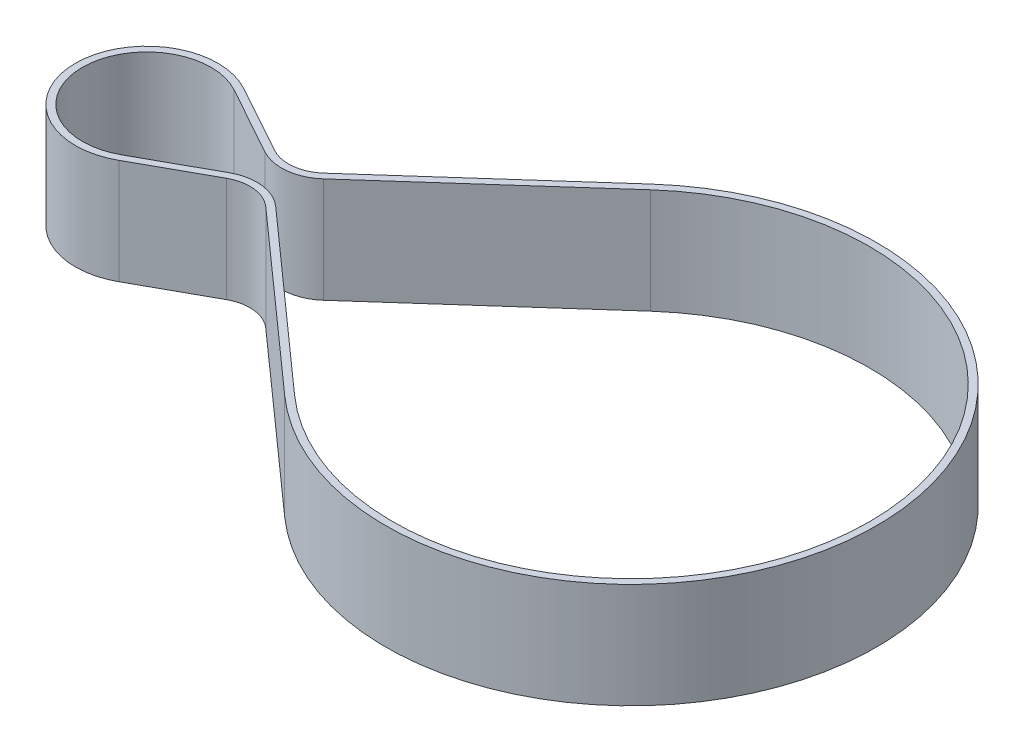
ISO-10303-21;
HEADER;
FILE_DESCRIPTION(('STEP AP214'),'2;1');
FILE_NAME('part.step','',(''),(''),'','','');
FILE_SCHEMA(('AUTOMOTIVE_DESIGN { 1 0 10303 214 1 1 1 1 }'));
ENDSEC;
DATA;
#1=APPLICATION_CONTEXT('core data for automotive mechanical design processes');
#2=APPLICATION_PROTOCOL_DEFINITION('international standard','automotive_design',2000,#1);
#3=PRODUCT_CONTEXT('',#1,'mechanical');
#4=PRODUCT('Part','Part','',(#3));
#5=PRODUCT_RELATED_PRODUCT_CATEGORY('part','',(#4));
#6=PRODUCT_DEFINITION_FORMATION('','',#4);
#7=PRODUCT_DEFINITION_CONTEXT('part definition',#1,'design');
#8=PRODUCT_DEFINITION('design','',#6,#7);
#9=PRODUCT_DEFINITION_SHAPE('','',#8);
#10=(LENGTH_UNIT() NAMED_UNIT(*) SI_UNIT(.MILLI.,.METRE.));
#11=(NAMED_UNIT(*) PLANE_ANGLE_UNIT() SI_UNIT($,.RADIAN.));
#12=(NAMED_UNIT(*) SI_UNIT($,.STERADIAN.) SOLID_ANGLE_UNIT());
#13=UNCERTAINTY_MEASURE_WITH_UNIT(LENGTH_MEASURE(1.E-05),#10,'distance_accuracy_value','');
#14=(GEOMETRIC_REPRESENTATION_CONTEXT(3) GLOBAL_UNCERTAINTY_ASSIGNED_CONTEXT((#13)) GLOBAL_UNIT_ASSIGNED_CONTEXT((#10,
#11,#12)) REPRESENTATION_CONTEXT('',''));
#15=CARTESIAN_POINT('',(0.,0.,0.));
#16=DIRECTION('',(0.,0.,1.));
#17=DIRECTION('',(1.,0.,0.));
#18=AXIS2_PLACEMENT_3D('',#15,#16,#17);
#19=CARTESIAN_POINT('',(-50.4883588292062,15.,-3.02002185360535));
#20=DIRECTION('',(0.,-1.,0.));
#21=DIRECTION('',(0.,0.,-1.));
#22=AXIS2_PLACEMENT_3D('',#19,#20,#21);
#23=CYLINDRICAL_SURFACE('',#22,9.17);
#24=CARTESIAN_POINT('',(-50.4883588292062,0.,-3.02002185360535));
#25=DIRECTION('',(0.,1.,0.));
#26=DIRECTION('',(0.,0.,1.));
#27=AXIS2_PLACEMENT_3D('',#24,#25,#26);
#28=CIRCLE('',#27,9.17);
#29=CARTESIAN_POINT('',(-46.0534820792553,0.,-11.0462767843152));
#30=VERTEX_POINT('',#29);
#31=CARTESIAN_POINT('',(-46.0534820792553,0.,5.0062330771045));
#32=VERTEX_POINT('',#31);
#33=EDGE_CURVE('E229',#30,#32,#28,.T.);
#34=ORIENTED_EDGE('',*,*,#33,.F.);
#35=DIRECTION('',(0.,-1.,0.));
#36=VECTOR('',#35,1.);
#37=CARTESIAN_POINT('',(-46.0534820792553,15.,-11.0462767843152));
#38=LINE('',#37,#36);
#39=CARTESIAN_POINT('',(-46.0534820792553,15.,-11.0462767843152));
#40=VERTEX_POINT('',#39);
#41=EDGE_CURVE('E11',#40,#30,#38,.T.);
#42=ORIENTED_EDGE('',*,*,#41,.F.);
#43=CARTESIAN_POINT('',(-50.4883588292062,15.,-3.02002185360535));
#44=DIRECTION('',(0.,1.,0.));
#45=DIRECTION('',(0.,0.,1.));
#46=AXIS2_PLACEMENT_3D('',#43,#44,#45);
#47=CIRCLE('',#46,9.17);
#48=CARTESIAN_POINT('',(-46.0534820792553,15.,5.0062330771045));
#49=VERTEX_POINT('',#48);
#50=EDGE_CURVE('E547',#40,#49,#47,.T.);
#51=ORIENTED_EDGE('',*,*,#50,.T.);
#52=DIRECTION('',(0.,-1.,0.));
#53=VECTOR('',#52,1.);
#54=CARTESIAN_POINT('',(-46.0534820792553,15.,5.0062330771045));
#55=LINE('',#54,#53);
#56=EDGE_CURVE('E63',#49,#32,#55,.T.);
#57=ORIENTED_EDGE('',*,*,#56,.T.);
#58=EDGE_LOOP('',(#34,#42,#51,#57));
#59=FACE_BOUND('',#58,.T.);
#60=ADVANCED_FACE('F43',(#59),#23,.F.);
#61=CARTESIAN_POINT('',(-6.09579559936457,15.,11.0321914778218));
#62=DIRECTION('',(0.483628871314175,0.,-0.875273165835316));
#63=DIRECTION('',(-0.875273165835316,0.,-0.483628871314175));
#64=AXIS2_PLACEMENT_3D('',#61,#62,#63);
#65=PLANE('',#64);
#66=DIRECTION('',(0.875273165835316,0.,0.483628871314175));
#67=VECTOR('',#66,1.);
#68=CARTESIAN_POINT('',(-6.09579559936457,0.,11.0321914778218));
#69=LINE('',#68,#67);
#70=CARTESIAN_POINT('',(-36.1619464927484,0.,-5.5807462756758));
#71=VERTEX_POINT('',#70);
#72=EDGE_CURVE('E232',#30,#71,#69,.T.);
#73=ORIENTED_EDGE('',*,*,#72,.T.);
#74=DIRECTION('',(0.,-1.,0.));
#75=VECTOR('',#74,1.);
#76=CARTESIAN_POINT('',(-36.1619464927484,15.,-5.5807462756758));
#77=LINE('',#76,#75);
#78=CARTESIAN_POINT('',(-36.1619464927484,15.,-5.5807462756758));
#79=VERTEX_POINT('',#78);
#80=EDGE_CURVE('E54',#79,#71,#77,.T.);
#81=ORIENTED_EDGE('',*,*,#80,.F.);
#82=DIRECTION('',(0.875273165835316,0.,0.483628871314175));
#83=VECTOR('',#82,1.);
#84=CARTESIAN_POINT('',(-6.09579559936457,15.,11.0321914778218));
#85=LINE('',#84,#83);
#86=EDGE_CURVE('E543',#40,#79,#85,.T.);
#87=ORIENTED_EDGE('',*,*,#86,.F.);
#88=ORIENTED_EDGE('',*,*,#41,.T.);
#89=EDGE_LOOP('',(#73,#81,#87,#88));
#90=FACE_BOUND('',#89,.T.);
#91=ADVANCED_FACE('F347',(#90),#65,.F.);
#92=CARTESIAN_POINT('',(-33.0183588292062,15.,-11.2700218536054));
#93=DIRECTION('',(0.,-1.,0.));
#94=DIRECTION('',(0.,0.,-1.));
#95=AXIS2_PLACEMENT_3D('',#92,#93,#94);
#96=CYLINDRICAL_SURFACE('',#95,6.5);
#97=CARTESIAN_POINT('',(-33.0183588292062,0.,-11.2700218536054));
#98=DIRECTION('',(0.,1.,0.));
#99=DIRECTION('',(0.,0.,1.));
#100=AXIS2_PLACEMENT_3D('',#97,#98,#99);
#101=CIRCLE('',#100,6.5);
#102=CARTESIAN_POINT('',(-28.695184756989,0.,-6.41614032009958));
#103=VERTEX_POINT('',#102);
#104=EDGE_CURVE('E236',#71,#103,#101,.T.);
#105=ORIENTED_EDGE('',*,*,#104,.T.);
#106=DIRECTION('',(0.,-1.,0.));
#107=VECTOR('',#106,1.);
#108=CARTESIAN_POINT('',(-28.695184756989,15.,-6.41614032009958));
#109=LINE('',#108,#107);
#110=CARTESIAN_POINT('',(-28.695184756989,15.,-6.41614032009958));
#111=VERTEX_POINT('',#110);
#112=EDGE_CURVE('E267',#111,#103,#109,.T.);
#113=ORIENTED_EDGE('',*,*,#112,.F.);
#114=CARTESIAN_POINT('',(-33.0183588292062,15.,-11.2700218536054));
#115=DIRECTION('',(0.,1.,0.));
#116=DIRECTION('',(0.,0.,1.));
#117=AXIS2_PLACEMENT_3D('',#114,#115,#116);
#118=CIRCLE('',#117,6.5);
#119=EDGE_CURVE('E540',#79,#111,#118,.T.);
#120=ORIENTED_EDGE('',*,*,#119,.F.);
#121=ORIENTED_EDGE('',*,*,#80,.T.);
#122=EDGE_LOOP('',(#105,#113,#120,#121));
#123=FACE_BOUND('',#122,.T.);
#124=ADVANCED_FACE('F352',(#123),#96,.T.);
#125=CARTESIAN_POINT('',(-15.8803704468532,15.,-17.8298249317724));
#126=DIRECTION('',(-0.665103703418041,0.,-0.746751005154735));
#127=DIRECTION('',(-0.746751005154735,0.,0.665103703418041));
#128=AXIS2_PLACEMENT_3D('',#125,#126,#127);
#129=PLANE('',#128);
#130=DIRECTION('',(0.746751005154735,0.,-0.665103703418041));
#131=VECTOR('',#130,1.);
#132=CARTESIAN_POINT('',(-15.8803704468532,0.,-17.8298249317724));
#133=LINE('',#132,#131);
#134=CARTESIAN_POINT('',(-4.00188474541963,0.,-28.4095560288663));
#135=VERTEX_POINT('',#134);
#136=EDGE_CURVE('E240',#103,#135,#133,.T.);
#137=ORIENTED_EDGE('',*,*,#136,.T.);
#138=DIRECTION('',(0.,-1.,0.));
#139=VECTOR('',#138,1.);
#140=CARTESIAN_POINT('',(-4.00188474541963,15.,-28.4095560288663));
#141=LINE('',#140,#139);
#142=CARTESIAN_POINT('',(-4.00188474541963,15.,-28.4095560288663));
#143=VERTEX_POINT('',#142);
#144=EDGE_CURVE('E264',#143,#135,#141,.T.);
#145=ORIENTED_EDGE('',*,*,#144,.F.);
#146=DIRECTION('',(0.746751005154735,0.,-0.665103703418041));
#147=VECTOR('',#146,1.);
#148=CARTESIAN_POINT('',(-15.8803704468532,15.,-17.8298249317724));
#149=LINE('',#148,#147);
#150=EDGE_CURVE('E192',#111,#143,#149,.T.);
#151=ORIENTED_EDGE('',*,*,#150,.F.);
#152=ORIENTED_EDGE('',*,*,#112,.T.);
#153=EDGE_LOOP('',(#137,#145,#151,#152));
#154=FACE_BOUND('',#153,.T.);
#155=ADVANCED_FACE('F498',(#154),#129,.F.);
#156=CARTESIAN_POINT('',(18.6116411707938,15.,-3.02002185360535));
#157=DIRECTION('',(0.,-1.,0.));
#158=DIRECTION('',(0.,0.,-1.));
#159=AXIS2_PLACEMENT_3D('',#156,#157,#158);
#160=CYLINDRICAL_SURFACE('',#159,34.);
#161=CARTESIAN_POINT('',(18.6116411707938,0.,-3.02002185360535));
#162=DIRECTION('',(0.,1.,0.));
#163=DIRECTION('',(0.,0.,1.));
#164=AXIS2_PLACEMENT_3D('',#161,#162,#163);
#165=CIRCLE('',#164,34.);
#166=CARTESIAN_POINT('',(-4.00188474541964,0.,22.3695123216556));
#167=VERTEX_POINT('',#166);
#168=EDGE_CURVE('E244',#167,#135,#165,.T.);
#169=ORIENTED_EDGE('',*,*,#168,.F.);
#170=DIRECTION('',(0.,-1.,0.));
#171=VECTOR('',#170,1.);
#172=CARTESIAN_POINT('',(-4.00188474541964,15.,22.3695123216556));
#173=LINE('',#172,#171);
#174=CARTESIAN_POINT('',(-4.00188474541964,15.,22.3695123216556));
#175=VERTEX_POINT('',#174);
#176=EDGE_CURVE('E175',#175,#167,#173,.T.);
#177=ORIENTED_EDGE('',*,*,#176,.F.);
#178=CARTESIAN_POINT('',(18.6116411707938,15.,-3.02002185360535));
#179=DIRECTION('',(0.,1.,0.));
#180=DIRECTION('',(0.,0.,1.));
#181=AXIS2_PLACEMENT_3D('',#178,#179,#180);
#182=CIRCLE('',#181,34.);
#183=EDGE_CURVE('E188',#175,#143,#182,.T.);
#184=ORIENTED_EDGE('',*,*,#183,.T.);
#185=ORIENTED_EDGE('',*,*,#144,.T.);
#186=EDGE_LOOP('',(#169,#177,#184,#185));
#187=FACE_BOUND('',#186,.T.);
#188=ADVANCED_FACE('F490',(#187),#160,.F.);
#189=CARTESIAN_POINT('',(-12.8804809102104,15.,14.4616726942662));
#190=DIRECTION('',(0.665103703418041,0.,-0.746751005154735));
#191=DIRECTION('',(-0.746751005154735,0.,-0.665103703418041));
#192=AXIS2_PLACEMENT_3D('',#189,#190,#191);
#193=PLANE('',#192);
#194=DIRECTION('',(0.746751005154735,0.,0.665103703418041));
#195=VECTOR('',#194,1.);
#196=CARTESIAN_POINT('',(-12.8804809102104,0.,14.4616726942662));
#197=LINE('',#196,#195);
#198=CARTESIAN_POINT('',(-28.695184756989,0.,0.376096612888868));
#199=VERTEX_POINT('',#198);
#200=EDGE_CURVE('E171',#199,#167,#197,.T.);
#201=ORIENTED_EDGE('',*,*,#200,.F.);
#202=DIRECTION('',(0.,-1.,0.));
#203=VECTOR('',#202,1.);
#204=CARTESIAN_POINT('',(-28.695184756989,15.,0.376096612888868));
#205=LINE('',#204,#203);
#206=CARTESIAN_POINT('',(-28.695184756989,15.,0.376096612888868));
#207=VERTEX_POINT('',#206);
#208=EDGE_CURVE('E165',#207,#199,#205,.T.);
#209=ORIENTED_EDGE('',*,*,#208,.F.);
#210=DIRECTION('',(0.746751005154735,0.,0.665103703418041));
#211=VECTOR('',#210,1.);
#212=CARTESIAN_POINT('',(-12.8804809102104,15.,14.4616726942662));
#213=LINE('',#212,#211);
#214=EDGE_CURVE('E169',#207,#175,#213,.T.);
#215=ORIENTED_EDGE('',*,*,#214,.T.);
#216=ORIENTED_EDGE('',*,*,#176,.T.);
#217=EDGE_LOOP('',(#201,#209,#215,#216));
#218=FACE_BOUND('',#217,.T.);
#219=ADVANCED_FACE('F167',(#218),#193,.T.);
#220=CARTESIAN_POINT('',(-33.0183588292062,15.,5.22997814639465));
#221=DIRECTION('',(0.,-1.,0.));
#222=DIRECTION('',(0.,0.,-1.));
#223=AXIS2_PLACEMENT_3D('',#220,#221,#222);
#224=CYLINDRICAL_SURFACE('',#223,6.5);
#225=CARTESIAN_POINT('',(-33.0183588292062,0.,5.22997814639465));
#226=DIRECTION('',(0.,1.,0.));
#227=DIRECTION('',(0.,0.,1.));
#228=AXIS2_PLACEMENT_3D('',#225,#226,#227);
#229=CIRCLE('',#228,6.5);
#230=CARTESIAN_POINT('',(-36.1619464927484,0.,-0.459297431534906));
#231=VERTEX_POINT('',#230);
#232=EDGE_CURVE('E250',#199,#231,#229,.T.);
#233=ORIENTED_EDGE('',*,*,#232,.T.);
#234=DIRECTION('',(0.,-1.,0.));
#235=VECTOR('',#234,1.);
#236=CARTESIAN_POINT('',(-36.1619464927484,15.,-0.459297431534906));
#237=LINE('',#236,#235);
#238=CARTESIAN_POINT('',(-36.1619464927484,15.,-0.459297431534906));
#239=VERTEX_POINT('',#238);
#240=EDGE_CURVE('E113',#239,#231,#237,.T.);
#241=ORIENTED_EDGE('',*,*,#240,.F.);
#242=CARTESIAN_POINT('',(-33.0183588292062,15.,5.22997814639465));
#243=DIRECTION('',(0.,1.,0.));
#244=DIRECTION('',(0.,0.,1.));
#245=AXIS2_PLACEMENT_3D('',#242,#243,#244);
#246=CIRCLE('',#245,6.5);
#247=EDGE_CURVE('E177',#207,#239,#246,.T.);
#248=ORIENTED_EDGE('',*,*,#247,.F.);
#249=ORIENTED_EDGE('',*,*,#208,.T.);
#250=EDGE_LOOP('',(#233,#241,#248,#249));
#251=FACE_BOUND('',#250,.T.);
#252=ADVANCED_FACE('F178',(#251),#224,.T.);
#253=CARTESIAN_POINT('',(-5.61216672805039,15.,10.1569183119865));
#254=DIRECTION('',(0.483628871314175,0.,-0.875273165835316));
#255=DIRECTION('',(-0.875273165835316,0.,-0.483628871314175));
#256=AXIS2_PLACEMENT_3D('',#253,#254,#255);
#257=PLANE('',#256);
#258=DIRECTION('',(0.875273165835317,0.,0.483628871314175));
#259=VECTOR('',#258,1.);
#260=CARTESIAN_POINT('',(-5.61216672805039,0.,10.1569183119865));
#261=LINE('',#260,#259);
#262=CARTESIAN_POINT('',(-45.5698532079411,0.,-11.9215499501505));
#263=VERTEX_POINT('',#262);
#264=CARTESIAN_POINT('',(-35.6783176214342,0.,-6.45601944151111));
#265=VERTEX_POINT('',#264);
#266=EDGE_CURVE('E199',#263,#265,#261,.T.);
#267=ORIENTED_EDGE('',*,*,#266,.F.);
#268=DIRECTION('',(0.,-1.,0.));
#269=VECTOR('',#268,1.);
#270=CARTESIAN_POINT('',(-45.5698532079411,15.,-11.9215499501505));
#271=LINE('',#270,#269);
#272=CARTESIAN_POINT('',(-45.5698532079411,15.,-11.9215499501505));
#273=VERTEX_POINT('',#272);
#274=EDGE_CURVE('E47',#273,#263,#271,.T.);
#275=ORIENTED_EDGE('',*,*,#274,.F.);
#276=DIRECTION('',(0.875273165835317,0.,0.483628871314175));
#277=VECTOR('',#276,1.);
#278=CARTESIAN_POINT('',(-5.61216672805039,15.,10.1569183119865));
#279=LINE('',#278,#277);
#280=CARTESIAN_POINT('',(-35.6783176214342,15.,-6.45601944151111));
#281=VERTEX_POINT('',#280);
#282=EDGE_CURVE('E257',#273,#281,#279,.T.);
#283=ORIENTED_EDGE('',*,*,#282,.T.);
#284=DIRECTION('',(0.,-1.,0.));
#285=VECTOR('',#284,1.);
#286=CARTESIAN_POINT('',(-35.6783176214342,15.,-6.45601944151111));
#287=LINE('',#286,#285);
#288=EDGE_CURVE('E198',#281,#265,#287,.T.);
#289=ORIENTED_EDGE('',*,*,#288,.T.);
#290=EDGE_LOOP('',(#267,#275,#283,#289));
#291=FACE_BOUND('',#290,.T.);
#292=ADVANCED_FACE('F45',(#291),#257,.T.);
#293=CARTESIAN_POINT('',(-50.4883588292062,15.,-3.02002185360535));
#294=DIRECTION('',(0.,-1.,0.));
#295=DIRECTION('',(0.,0.,-1.));
#296=AXIS2_PLACEMENT_3D('',#293,#294,#295);
#297=CYLINDRICAL_SURFACE('',#296,10.17);
#298=CARTESIAN_POINT('',(-50.4883588292062,0.,-3.02002185360535));
#299=DIRECTION('',(0.,1.,0.));
#300=DIRECTION('',(0.,0.,1.));
#301=AXIS2_PLACEMENT_3D('',#298,#299,#300);
#302=CIRCLE('',#301,10.17);
#303=CARTESIAN_POINT('',(-45.5698532079411,0.,5.88150624293982));
#304=VERTEX_POINT('',#303);
#305=EDGE_CURVE('E203',#263,#304,#302,.T.);
#306=ORIENTED_EDGE('',*,*,#305,.T.);
#307=DIRECTION('',(0.,-1.,0.));
#308=VECTOR('',#307,1.);
#309=CARTESIAN_POINT('',(-45.5698532079411,15.,5.88150624293982));
#310=LINE('',#309,#308);
#311=CARTESIAN_POINT('',(-45.5698532079411,15.,5.88150624293982));
#312=VERTEX_POINT('',#311);
#313=EDGE_CURVE('E291',#312,#304,#310,.T.);
#314=ORIENTED_EDGE('',*,*,#313,.F.);
#315=CARTESIAN_POINT('',(-50.4883588292062,15.,-3.02002185360535));
#316=DIRECTION('',(0.,1.,0.));
#317=DIRECTION('',(0.,0.,1.));
#318=AXIS2_PLACEMENT_3D('',#315,#316,#317);
#319=CIRCLE('',#318,10.17);
#320=EDGE_CURVE('E302',#273,#312,#319,.T.);
#321=ORIENTED_EDGE('',*,*,#320,.F.);
#322=ORIENTED_EDGE('',*,*,#274,.T.);
#323=EDGE_LOOP('',(#306,#314,#321,#322));
#324=FACE_BOUND('',#323,.T.);
#325=ADVANCED_FACE('F301',(#324),#297,.T.);
#326=CARTESIAN_POINT('',(-8.16896176427345,15.,-14.7842146097983));
#327=DIRECTION('',(-0.483628871314175,0.,-0.875273165835316));
#328=DIRECTION('',(-0.875273165835316,0.,0.483628871314175));
#329=AXIS2_PLACEMENT_3D('',#326,#327,#328);
#330=PLANE('',#329);
#331=DIRECTION('',(0.875273165835316,0.,-0.483628871314175));
#332=VECTOR('',#331,1.);
#333=CARTESIAN_POINT('',(-8.16896176427345,0.,-14.7842146097983));
#334=LINE('',#333,#332);
#335=CARTESIAN_POINT('',(-35.6783176214342,0.,0.415975734300411));
#336=VERTEX_POINT('',#335);
#337=EDGE_CURVE('E206',#304,#336,#334,.T.);
#338=ORIENTED_EDGE('',*,*,#337,.T.);
#339=DIRECTION('',(0.,-1.,0.));
#340=VECTOR('',#339,1.);
#341=CARTESIAN_POINT('',(-35.6783176214342,15.,0.415975734300411));
#342=LINE('',#341,#340);
#343=CARTESIAN_POINT('',(-35.6783176214342,15.,0.415975734300411));
#344=VERTEX_POINT('',#343);
#345=EDGE_CURVE('E289',#344,#336,#342,.T.);
#346=ORIENTED_EDGE('',*,*,#345,.F.);
#347=DIRECTION('',(0.875273165835316,0.,-0.483628871314175));
#348=VECTOR('',#347,1.);
#349=CARTESIAN_POINT('',(-8.16896176427345,15.,-14.7842146097983));
#350=LINE('',#349,#348);
#351=EDGE_CURVE('E562',#312,#344,#350,.T.);
#352=ORIENTED_EDGE('',*,*,#351,.F.);
#353=ORIENTED_EDGE('',*,*,#313,.T.);
#354=EDGE_LOOP('',(#338,#346,#352,#353));
#355=FACE_BOUND('',#354,.T.);
#356=ADVANCED_FACE('F338',(#355),#330,.F.);
#357=CARTESIAN_POINT('',(-33.0183588292062,15.,5.22997814639465));
#358=DIRECTION('',(0.,-1.,0.));
#359=DIRECTION('',(0.,0.,-1.));
#360=AXIS2_PLACEMENT_3D('',#357,#358,#359);
#361=CYLINDRICAL_SURFACE('',#360,5.5);
#362=CARTESIAN_POINT('',(-33.0183588292062,0.,5.22997814639465));
#363=DIRECTION('',(0.,1.,0.));
#364=DIRECTION('',(0.,0.,1.));
#365=AXIS2_PLACEMENT_3D('',#362,#363,#364);
#366=CIRCLE('',#365,5.5);
#367=CARTESIAN_POINT('',(-29.360288460407,0.,1.12284761804361));
#368=VERTEX_POINT('',#367);
#369=EDGE_CURVE('E210',#368,#336,#366,.T.);
#370=ORIENTED_EDGE('',*,*,#369,.F.);
#371=DIRECTION('',(0.,-1.,0.));
#372=VECTOR('',#371,1.);
#373=CARTESIAN_POINT('',(-29.360288460407,15.,1.12284761804361));
#374=LINE('',#373,#372);
#375=CARTESIAN_POINT('',(-29.360288460407,15.,1.12284761804361));
#376=VERTEX_POINT('',#375);
#377=EDGE_CURVE('E286',#376,#368,#374,.T.);
#378=ORIENTED_EDGE('',*,*,#377,.F.);
#379=CARTESIAN_POINT('',(-33.0183588292062,15.,5.22997814639465));
#380=DIRECTION('',(0.,1.,0.));
#381=DIRECTION('',(0.,0.,1.));
#382=AXIS2_PLACEMENT_3D('',#379,#380,#381);
#383=CIRCLE('',#382,5.5);
#384=EDGE_CURVE('E337',#376,#344,#383,.T.);
#385=ORIENTED_EDGE('',*,*,#384,.T.);
#386=ORIENTED_EDGE('',*,*,#345,.T.);
#387=EDGE_LOOP('',(#370,#378,#385,#386));
#388=FACE_BOUND('',#387,.T.);
#389=ADVANCED_FACE('F334',(#388),#361,.F.);
#390=CARTESIAN_POINT('',(-13.5455846136284,15.,15.2084236994209));
#391=DIRECTION('',(0.665103703418041,0.,-0.746751005154735));
#392=DIRECTION('',(-0.746751005154735,0.,-0.665103703418041));
#393=AXIS2_PLACEMENT_3D('',#390,#391,#392);
#394=PLANE('',#393);
#395=DIRECTION('',(0.746751005154735,0.,0.665103703418041));
#396=VECTOR('',#395,1.);
#397=CARTESIAN_POINT('',(-13.5455846136284,0.,15.2084236994209));
#398=LINE('',#397,#396);
#399=CARTESIAN_POINT('',(-4.6669884488377,0.,23.1162633268104));
#400=VERTEX_POINT('',#399);
#401=EDGE_CURVE('E214',#368,#400,#398,.T.);
#402=ORIENTED_EDGE('',*,*,#401,.T.);
#403=DIRECTION('',(0.,-1.,0.));
#404=VECTOR('',#403,1.);
#405=CARTESIAN_POINT('',(-4.6669884488377,15.,23.1162633268104));
#406=LINE('',#405,#404);
#407=CARTESIAN_POINT('',(-4.6669884488377,15.,23.1162633268104));
#408=VERTEX_POINT('',#407);
#409=EDGE_CURVE('E282',#408,#400,#406,.T.);
#410=ORIENTED_EDGE('',*,*,#409,.F.);
#411=DIRECTION('',(0.746751005154735,0.,0.665103703418041));
#412=VECTOR('',#411,1.);
#413=CARTESIAN_POINT('',(-13.5455846136284,15.,15.2084236994209));
#414=LINE('',#413,#412);
#415=EDGE_CURVE('E330',#376,#408,#414,.T.);
#416=ORIENTED_EDGE('',*,*,#415,.F.);
#417=ORIENTED_EDGE('',*,*,#377,.T.);
#418=EDGE_LOOP('',(#402,#410,#416,#417));
#419=FACE_BOUND('',#418,.T.);
#420=ADVANCED_FACE('F329',(#419),#394,.F.);
#421=CARTESIAN_POINT('',(18.6116411707938,15.,-3.02002185360535));
#422=DIRECTION('',(0.,-1.,0.));
#423=DIRECTION('',(0.,0.,-1.));
#424=AXIS2_PLACEMENT_3D('',#421,#422,#423);
#425=CYLINDRICAL_SURFACE('',#424,35.);
#426=CARTESIAN_POINT('',(18.6116411707938,0.,-3.02002185360535));
#427=DIRECTION('',(0.,1.,0.));
#428=DIRECTION('',(0.,0.,1.));
#429=AXIS2_PLACEMENT_3D('',#426,#427,#428);
#430=CIRCLE('',#429,35.);
#431=CARTESIAN_POINT('',(-4.6669884488377,0.,-29.1563070340211));
#432=VERTEX_POINT('',#431);
#433=EDGE_CURVE('E217',#400,#432,#430,.T.);
#434=ORIENTED_EDGE('',*,*,#433,.T.);
#435=DIRECTION('',(0.,-1.,0.));
#436=VECTOR('',#435,1.);
#437=CARTESIAN_POINT('',(-4.6669884488377,15.,-29.1563070340211));
#438=LINE('',#437,#436);
#439=CARTESIAN_POINT('',(-4.6669884488377,15.,-29.1563070340211));
#440=VERTEX_POINT('',#439);
#441=EDGE_CURVE('E279',#440,#432,#438,.T.);
#442=ORIENTED_EDGE('',*,*,#441,.F.);
#443=CARTESIAN_POINT('',(18.6116411707938,15.,-3.02002185360535));
#444=DIRECTION('',(0.,1.,0.));
#445=DIRECTION('',(0.,0.,1.));
#446=AXIS2_PLACEMENT_3D('',#443,#444,#445);
#447=CIRCLE('',#446,35.);
#448=EDGE_CURVE('E326',#408,#440,#447,.T.);
#449=ORIENTED_EDGE('',*,*,#448,.F.);
#450=ORIENTED_EDGE('',*,*,#409,.T.);
#451=EDGE_LOOP('',(#434,#442,#449,#450));
#452=FACE_BOUND('',#451,.T.);
#453=ADVANCED_FACE('F324',(#452),#425,.T.);
#454=CARTESIAN_POINT('',(-16.5454741502712,15.,-18.5765759369272));
#455=DIRECTION('',(-0.665103703418041,0.,-0.746751005154735));
#456=DIRECTION('',(-0.746751005154735,0.,0.665103703418041));
#457=AXIS2_PLACEMENT_3D('',#454,#455,#456);
#458=PLANE('',#457);
#459=DIRECTION('',(0.746751005154735,0.,-0.665103703418041));
#460=VECTOR('',#459,1.);
#461=CARTESIAN_POINT('',(-16.5454741502712,0.,-18.5765759369272));
#462=LINE('',#461,#460);
#463=CARTESIAN_POINT('',(-29.360288460407,0.,-7.16289132525431));
#464=VERTEX_POINT('',#463);
#465=EDGE_CURVE('E221',#464,#432,#462,.T.);
#466=ORIENTED_EDGE('',*,*,#465,.F.);
#467=DIRECTION('',(0.,-1.,0.));
#468=VECTOR('',#467,1.);
#469=CARTESIAN_POINT('',(-29.360288460407,15.,-7.16289132525431));
#470=LINE('',#469,#468);
#471=CARTESIAN_POINT('',(-29.360288460407,15.,-7.16289132525431));
#472=VERTEX_POINT('',#471);
#473=EDGE_CURVE('E276',#472,#464,#470,.T.);
#474=ORIENTED_EDGE('',*,*,#473,.F.);
#475=DIRECTION('',(0.746751005154735,0.,-0.665103703418041));
#476=VECTOR('',#475,1.);
#477=CARTESIAN_POINT('',(-16.5454741502712,15.,-18.5765759369272));
#478=LINE('',#477,#476);
#479=EDGE_CURVE('E321',#472,#440,#478,.T.);
#480=ORIENTED_EDGE('',*,*,#479,.T.);
#481=ORIENTED_EDGE('',*,*,#441,.T.);
#482=EDGE_LOOP('',(#466,#474,#480,#481));
#483=FACE_BOUND('',#482,.T.);
#484=ADVANCED_FACE('F317',(#483),#458,.T.);
#485=CARTESIAN_POINT('',(-33.0183588292062,15.,-11.2700218536054));
#486=DIRECTION('',(0.,-1.,0.));
#487=DIRECTION('',(0.,0.,-1.));
#488=AXIS2_PLACEMENT_3D('',#485,#486,#487);
#489=CYLINDRICAL_SURFACE('',#488,5.5);
#490=CARTESIAN_POINT('',(-33.0183588292062,0.,-11.2700218536054));
#491=DIRECTION('',(0.,1.,0.));
#492=DIRECTION('',(0.,0.,1.));
#493=AXIS2_PLACEMENT_3D('',#490,#491,#492);
#494=CIRCLE('',#493,5.5);
#495=EDGE_CURVE('E225',#265,#464,#494,.T.);
#496=ORIENTED_EDGE('',*,*,#495,.F.);
#497=ORIENTED_EDGE('',*,*,#288,.F.);
#498=CARTESIAN_POINT('',(-33.0183588292062,15.,-11.2700218536054));
#499=DIRECTION('',(0.,1.,0.));
#500=DIRECTION('',(0.,0.,1.));
#501=AXIS2_PLACEMENT_3D('',#498,#499,#500);
#502=CIRCLE('',#501,5.5);
#503=EDGE_CURVE('E312',#281,#472,#502,.T.);
#504=ORIENTED_EDGE('',*,*,#503,.T.);
#505=ORIENTED_EDGE('',*,*,#473,.T.);
#506=EDGE_LOOP('',(#496,#497,#504,#505));
#507=FACE_BOUND('',#506,.T.);
#508=ADVANCED_FACE('F311',(#507),#489,.F.);
#509=CARTESIAN_POINT('',(-8.65259063558763,15.,-15.6594877756336));
#510=DIRECTION('',(-0.483628871314175,0.,-0.875273165835316));
#511=DIRECTION('',(-0.875273165835316,0.,0.483628871314175));
#512=AXIS2_PLACEMENT_3D('',#509,#510,#511);
#513=PLANE('',#512);
#514=DIRECTION('',(0.875273165835316,0.,-0.483628871314175));
#515=VECTOR('',#514,1.);
#516=CARTESIAN_POINT('',(-8.65259063558763,0.,-15.6594877756336));
#517=LINE('',#516,#515);
#518=EDGE_CURVE('E253',#32,#231,#517,.T.);
#519=ORIENTED_EDGE('',*,*,#518,.F.);
#520=ORIENTED_EDGE('',*,*,#56,.F.);
#521=DIRECTION('',(0.875273165835316,0.,-0.483628871314175));
#522=VECTOR('',#521,1.);
#523=CARTESIAN_POINT('',(-8.65259063558763,15.,-15.6594877756336));
#524=LINE('',#523,#522);
#525=EDGE_CURVE('E182',#49,#239,#524,.T.);
#526=ORIENTED_EDGE('',*,*,#525,.T.);
#527=ORIENTED_EDGE('',*,*,#240,.T.);
#528=EDGE_LOOP('',(#519,#520,#526,#527));
#529=FACE_BOUND('',#528,.T.);
#530=ADVANCED_FACE('F359',(#529),#513,.T.);
#531=CARTESIAN_POINT('',(0.,15.,0.));
#532=DIRECTION('',(0.,1.,0.));
#533=DIRECTION('',(0.,0.,1.));
#534=AXIS2_PLACEMENT_3D('',#531,#532,#533);
#535=PLANE('',#534);
#536=ORIENTED_EDGE('',*,*,#282,.F.);
#537=ORIENTED_EDGE('',*,*,#320,.T.);
#538=ORIENTED_EDGE('',*,*,#351,.T.);
#539=ORIENTED_EDGE('',*,*,#384,.F.);
#540=ORIENTED_EDGE('',*,*,#415,.T.);
#541=ORIENTED_EDGE('',*,*,#448,.T.);
#542=ORIENTED_EDGE('',*,*,#479,.F.);
#543=ORIENTED_EDGE('',*,*,#503,.F.);
#544=EDGE_LOOP('',(#536,#537,#538,#539,#540,#541,#542,#543));
#545=FACE_BOUND('',#544,.T.);
#546=ORIENTED_EDGE('',*,*,#50,.F.);
#547=ORIENTED_EDGE('',*,*,#86,.T.);
#548=ORIENTED_EDGE('',*,*,#119,.T.);
#549=ORIENTED_EDGE('',*,*,#150,.T.);
#550=ORIENTED_EDGE('',*,*,#183,.F.);
#551=ORIENTED_EDGE('',*,*,#214,.F.);
#552=ORIENTED_EDGE('',*,*,#247,.T.);
#553=ORIENTED_EDGE('',*,*,#525,.F.);
#554=EDGE_LOOP('',(#546,#547,#548,#549,#550,#551,#552,#553));
#555=FACE_BOUND('',#554,.T.);
#556=ADVANCED_FACE('F186',(#545,#555),#535,.T.);
#557=CARTESIAN_POINT('',(0.,0.,0.));
#558=DIRECTION('',(0.,1.,0.));
#559=DIRECTION('',(0.,0.,1.));
#560=AXIS2_PLACEMENT_3D('',#557,#558,#559);
#561=PLANE('',#560);
#562=ORIENTED_EDGE('',*,*,#266,.T.);
#563=ORIENTED_EDGE('',*,*,#495,.T.);
#564=ORIENTED_EDGE('',*,*,#465,.T.);
#565=ORIENTED_EDGE('',*,*,#433,.F.);
#566=ORIENTED_EDGE('',*,*,#401,.F.);
#567=ORIENTED_EDGE('',*,*,#369,.T.);
#568=ORIENTED_EDGE('',*,*,#337,.F.);
#569=ORIENTED_EDGE('',*,*,#305,.F.);
#570=EDGE_LOOP('',(#562,#563,#564,#565,#566,#567,#568,#569));
#571=FACE_BOUND('',#570,.T.);
#572=ORIENTED_EDGE('',*,*,#33,.T.);
#573=ORIENTED_EDGE('',*,*,#518,.T.);
#574=ORIENTED_EDGE('',*,*,#232,.F.);
#575=ORIENTED_EDGE('',*,*,#200,.T.);
#576=ORIENTED_EDGE('',*,*,#168,.T.);
#577=ORIENTED_EDGE('',*,*,#136,.F.);
#578=ORIENTED_EDGE('',*,*,#104,.F.);
#579=ORIENTED_EDGE('',*,*,#72,.F.);
#580=EDGE_LOOP('',(#572,#573,#574,#575,#576,#577,#578,#579));
#581=FACE_BOUND('',#580,.T.);
#582=ADVANCED_FACE('F305',(#571,#581),#561,.F.);
#583=CLOSED_SHELL('',(#60,#91,#124,#155,#188,#219,#252,#292,#325,#356,#389,#420,#453,#484,#508,
#530,#556,#582));
#584=MANIFOLD_SOLID_BREP('B2',#583);
#585=ADVANCED_BREP_SHAPE_REPRESENTATION('',(#18,#584),#14);
#586=SHAPE_DEFINITION_REPRESENTATION(#9,#585);
ENDSEC;
END-ISO-10303-21;
